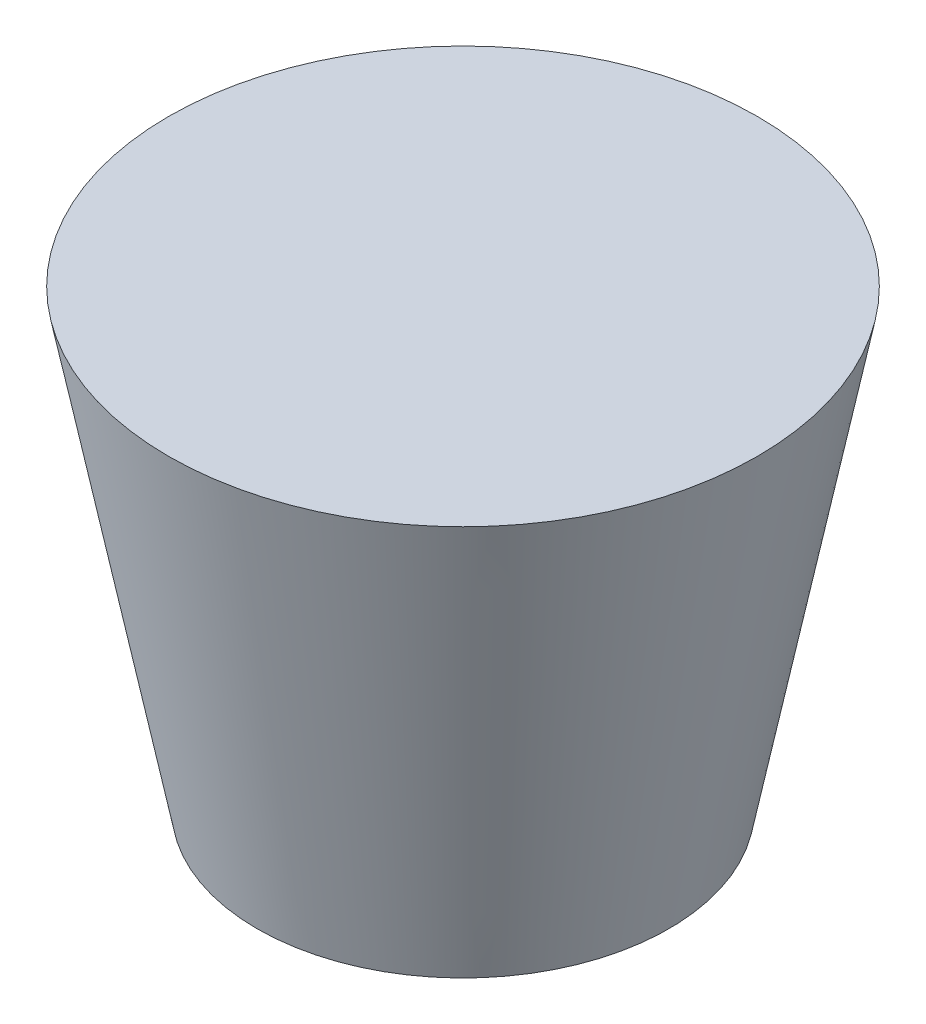
ISO-10303-21;
HEADER;
FILE_DESCRIPTION(('STEP AP214'),'2;1');
FILE_NAME('part.step','',(''),(''),'','','');
FILE_SCHEMA(('AUTOMOTIVE_DESIGN { 1 0 10303 214 1 1 1 1 }'));
ENDSEC;
DATA;
#1=APPLICATION_CONTEXT('core data for automotive mechanical design processes');
#2=APPLICATION_PROTOCOL_DEFINITION('international standard','automotive_design',2000,#1);
#3=PRODUCT_CONTEXT('',#1,'mechanical');
#4=PRODUCT('Part','Part','',(#3));
#5=PRODUCT_RELATED_PRODUCT_CATEGORY('part','',(#4));
#6=PRODUCT_DEFINITION_FORMATION('','',#4);
#7=PRODUCT_DEFINITION_CONTEXT('part definition',#1,'design');
#8=PRODUCT_DEFINITION('design','',#6,#7);
#9=PRODUCT_DEFINITION_SHAPE('','',#8);
#10=(LENGTH_UNIT() NAMED_UNIT(*) SI_UNIT(.MILLI.,.METRE.));
#11=(NAMED_UNIT(*) PLANE_ANGLE_UNIT() SI_UNIT($,.RADIAN.));
#12=(NAMED_UNIT(*) SI_UNIT($,.STERADIAN.) SOLID_ANGLE_UNIT());
#13=UNCERTAINTY_MEASURE_WITH_UNIT(LENGTH_MEASURE(1.E-05),#10,'distance_accuracy_value','');
#14=(GEOMETRIC_REPRESENTATION_CONTEXT(3) GLOBAL_UNCERTAINTY_ASSIGNED_CONTEXT((#13)) GLOBAL_UNIT_ASSIGNED_CONTEXT((#10,
#11,#12)) REPRESENTATION_CONTEXT('',''));
#15=CARTESIAN_POINT('',(0.,0.,0.));
#16=DIRECTION('',(0.,0.,1.));
#17=DIRECTION('',(1.,0.,0.));
#18=AXIS2_PLACEMENT_3D('',#15,#16,#17);
#19=CARTESIAN_POINT('',(100.387267904509,-145.864721485411,0.));
#20=DIRECTION('',(0.,-1.,0.));
#21=DIRECTION('',(0.,0.,-1.));
#22=AXIS2_PLACEMENT_3D('',#19,#20,#21);
#23=PLANE('',#22);
#24=CARTESIAN_POINT('',(0.,-145.864721485411,0.));
#25=DIRECTION('',(0.,1.,0.));
#26=DIRECTION('',(0.,0.,1.));
#27=AXIS2_PLACEMENT_3D('',#24,#25,#26);
#28=CIRCLE('',#27,100.387267904509);
#29=CARTESIAN_POINT('',(0.,-145.864721485411,100.387267904509));
#30=VERTEX_POINT('',#29);
#31=EDGE_CURVE('E10',#30,#30,#28,.T.);
#32=ORIENTED_EDGE('',*,*,#31,.F.);
#33=EDGE_LOOP('',(#32));
#34=FACE_BOUND('',#33,.T.);
#35=ADVANCED_FACE('F32',(#34),#23,.T.);
#36=CARTESIAN_POINT('',(0.,75.1220159151194,0.));
#37=DIRECTION('',(0.,1.,0.));
#38=DIRECTION('',(0.,0.,1.));
#39=AXIS2_PLACEMENT_3D('',#36,#37,#38);
#40=CONICAL_SURFACE('',#39,143.506631299735,0.192700758662386);
#41=ORIENTED_EDGE('',*,*,#31,.T.);
#42=EDGE_LOOP('',(#41));
#43=FACE_BOUND('',#42,.T.);
#44=CARTESIAN_POINT('',(0.,75.1220159151194,0.));
#45=DIRECTION('',(0.,1.,0.));
#46=DIRECTION('',(0.,0.,1.));
#47=AXIS2_PLACEMENT_3D('',#44,#45,#46);
#48=CIRCLE('',#47,143.506631299735);
#49=CARTESIAN_POINT('',(0.,75.1220159151194,143.506631299735));
#50=VERTEX_POINT('',#49);
#51=EDGE_CURVE('E40',#50,#50,#48,.T.);
#52=ORIENTED_EDGE('',*,*,#51,.F.);
#53=EDGE_LOOP('',(#52));
#54=FACE_BOUND('',#53,.T.);
#55=ADVANCED_FACE('F72',(#43,#54),#40,.T.);
#56=CARTESIAN_POINT('',(0.,75.1220159151194,0.));
#57=DIRECTION('',(0.,1.,0.));
#58=DIRECTION('',(0.,0.,1.));
#59=AXIS2_PLACEMENT_3D('',#56,#57,#58);
#60=PLANE('',#59);
#61=ORIENTED_EDGE('',*,*,#51,.T.);
#62=EDGE_LOOP('',(#61));
#63=FACE_BOUND('',#62,.T.);
#64=ADVANCED_FACE('F69',(#63),#60,.T.);
#65=CLOSED_SHELL('',(#35,#55,#64));
#66=CARTESIAN_POINT('',(100.387267904509,-143.324721485411,0.));
#67=DIRECTION('',(0.,-1.,0.));
#68=DIRECTION('',(0.,0.,-1.));
#69=AXIS2_PLACEMENT_3D('',#66,#67,#68);
#70=PLANE('',#69);
#71=CARTESIAN_POINT('',(0.,-143.324721485411,0.));
#72=DIRECTION('',(0.,1.,0.));
#73=DIRECTION('',(0.,0.,1.));
#74=AXIS2_PLACEMENT_3D('',#71,#72,#73);
#75=CIRCLE('',#74,98.2949771543395);
#76=CARTESIAN_POINT('',(0.,-143.324721485411,98.2949771543395));
#77=VERTEX_POINT('',#76);
#78=EDGE_CURVE('E48',#77,#77,#75,.T.);
#79=ORIENTED_EDGE('',*,*,#78,.T.);
#80=EDGE_LOOP('',(#79));
#81=FACE_BOUND('',#80,.T.);
#82=ADVANCED_FACE('F34',(#81),#70,.F.);
#83=CARTESIAN_POINT('',(0.,72.5820159151194,0.));
#84=DIRECTION('',(0.,1.,0.));
#85=DIRECTION('',(0.,0.,1.));
#86=AXIS2_PLACEMENT_3D('',#83,#84,#85);
#87=PLANE('',#86);
#88=CARTESIAN_POINT('',(0.,72.5820159151194,0.));
#89=DIRECTION('',(0.,1.,0.));
#90=DIRECTION('',(0.,0.,1.));
#91=AXIS2_PLACEMENT_3D('',#88,#89,#90);
#92=CIRCLE('',#91,140.42312103737);
#93=CARTESIAN_POINT('',(0.,72.5820159151194,140.42312103737));
#94=VERTEX_POINT('',#93);
#95=EDGE_CURVE('E44',#94,#94,#92,.T.);
#96=ORIENTED_EDGE('',*,*,#95,.F.);
#97=EDGE_LOOP('',(#96));
#98=FACE_BOUND('',#97,.T.);
#99=ADVANCED_FACE('F58',(#98),#87,.F.);
#100=CARTESIAN_POINT('',(0.,72.5820159151194,0.));
#101=DIRECTION('',(0.,1.,0.));
#102=DIRECTION('',(0.,0.,1.));
#103=AXIS2_PLACEMENT_3D('',#100,#101,#102);
#104=CONICAL_SURFACE('',#103,140.42312103737,0.192700758662386);
#105=ORIENTED_EDGE('',*,*,#78,.F.);
#106=EDGE_LOOP('',(#105));
#107=FACE_BOUND('',#106,.T.);
#108=ORIENTED_EDGE('',*,*,#95,.T.);
#109=EDGE_LOOP('',(#108));
#110=FACE_BOUND('',#109,.T.);
#111=ADVANCED_FACE('F55',(#107,#110),#104,.F.);
#112=CLOSED_SHELL('',(#82,#99,#111));
#113=ORIENTED_CLOSED_SHELL('',*,#112,.T.);
#114=BREP_WITH_VOIDS('B2',#65,(#113));
#115=ADVANCED_BREP_SHAPE_REPRESENTATION('',(#18,#114),#14);
#116=SHAPE_DEFINITION_REPRESENTATION(#9,#115);
ENDSEC;
END-ISO-10303-21;
